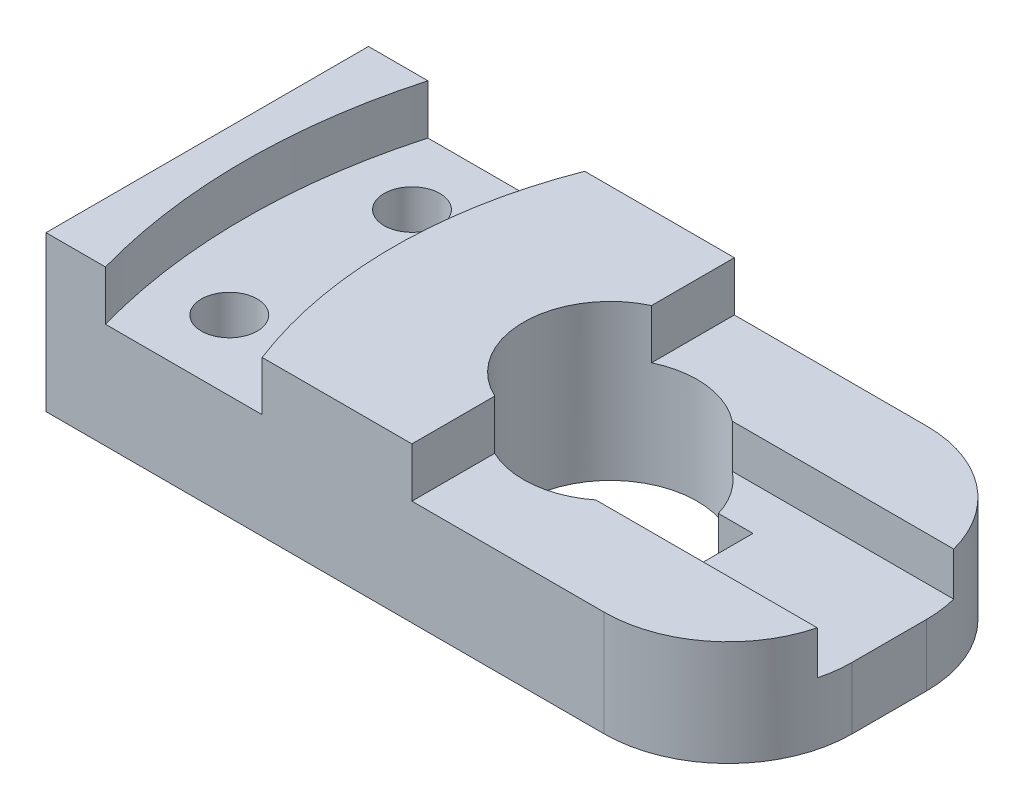
ISO-10303-21;
HEADER;
FILE_DESCRIPTION(('STEP AP214'),'2;1');
FILE_NAME('part.step','',(''),(''),'','','');
FILE_SCHEMA(('AUTOMOTIVE_DESIGN { 1 0 10303 214 1 1 1 1 }'));
ENDSEC;
DATA;
#1=APPLICATION_CONTEXT('core data for automotive mechanical design processes');
#2=APPLICATION_PROTOCOL_DEFINITION('international standard','automotive_design',2000,#1);
#3=PRODUCT_CONTEXT('',#1,'mechanical');
#4=PRODUCT('Part','Part','',(#3));
#5=PRODUCT_RELATED_PRODUCT_CATEGORY('part','',(#4));
#6=PRODUCT_DEFINITION_FORMATION('','',#4);
#7=PRODUCT_DEFINITION_CONTEXT('part definition',#1,'design');
#8=PRODUCT_DEFINITION('design','',#6,#7);
#9=PRODUCT_DEFINITION_SHAPE('','',#8);
#10=(LENGTH_UNIT() NAMED_UNIT(*) SI_UNIT(.MILLI.,.METRE.));
#11=(NAMED_UNIT(*) PLANE_ANGLE_UNIT() SI_UNIT($,.RADIAN.));
#12=(NAMED_UNIT(*) SI_UNIT($,.STERADIAN.) SOLID_ANGLE_UNIT());
#13=UNCERTAINTY_MEASURE_WITH_UNIT(LENGTH_MEASURE(1.E-05),#10,'distance_accuracy_value','');
#14=(GEOMETRIC_REPRESENTATION_CONTEXT(3) GLOBAL_UNCERTAINTY_ASSIGNED_CONTEXT((#13)) GLOBAL_UNIT_ASSIGNED_CONTEXT((#10,
#11,#12)) REPRESENTATION_CONTEXT('',''));
#15=CARTESIAN_POINT('',(0.,0.,0.));
#16=DIRECTION('',(0.,0.,1.));
#17=DIRECTION('',(1.,0.,0.));
#18=AXIS2_PLACEMENT_3D('',#15,#16,#17);
#19=CARTESIAN_POINT('',(0.,17.,0.));
#20=DIRECTION('',(0.,1.,0.));
#21=DIRECTION('',(0.,0.,1.));
#22=AXIS2_PLACEMENT_3D('',#19,#20,#21);
#23=PLANE('',#22);
#24=CARTESIAN_POINT('',(18.2858491223178,17.,-14.728915195243));
#25=DIRECTION('',(0.,1.,0.));
#26=DIRECTION('',(0.,0.,1.));
#27=AXIS2_PLACEMENT_3D('',#24,#25,#26);
#28=CIRCLE('',#27,4.5);
#29=CARTESIAN_POINT('',(18.2858491223178,17.,-10.228915195243));
#30=VERTEX_POINT('',#29);
#31=EDGE_CURVE('E285',#30,#30,#28,.T.);
#32=ORIENTED_EDGE('',*,*,#31,.F.);
#33=EDGE_LOOP('',(#32));
#34=FACE_BOUND('',#33,.T.);
#35=CARTESIAN_POINT('',(18.2858491223178,17.,14.728915195243));
#36=DIRECTION('',(0.,1.,0.));
#37=DIRECTION('',(0.,0.,1.));
#38=AXIS2_PLACEMENT_3D('',#35,#36,#37);
#39=CIRCLE('',#38,4.5);
#40=CARTESIAN_POINT('',(18.2858491223178,17.,19.228915195243));
#41=VERTEX_POINT('',#40);
#42=EDGE_CURVE('E315',#41,#41,#39,.F.);
#43=ORIENTED_EDGE('',*,*,#42,.T.);
#44=EDGE_LOOP('',(#43));
#45=FACE_BOUND('',#44,.T.);
#46=DIRECTION('',(1.,0.,0.));
#47=VECTOR('',#46,1.);
#48=CARTESIAN_POINT('',(0.,17.,26.));
#49=LINE('',#48,#47);
#50=CARTESIAN_POINT('',(9.58787958281661,17.,26.));
#51=VERTEX_POINT('',#50);
#52=CARTESIAN_POINT('',(34.8583586736219,17.,26.));
#53=VERTEX_POINT('',#52);
#54=EDGE_CURVE('E290',#51,#53,#49,.T.);
#55=ORIENTED_EDGE('',*,*,#54,.T.);
#56=CARTESIAN_POINT('',(102.,17.,0.));
#57=DIRECTION('',(0.,1.,0.));
#58=DIRECTION('',(0.,0.,1.));
#59=AXIS2_PLACEMENT_3D('',#56,#57,#58);
#60=CIRCLE('',#59,72.);
#61=CARTESIAN_POINT('',(34.8583586736219,17.,-26.));
#62=VERTEX_POINT('',#61);
#63=EDGE_CURVE('E11',#53,#62,#60,.F.);
#64=ORIENTED_EDGE('',*,*,#63,.T.);
#65=DIRECTION('',(1.,0.,0.));
#66=VECTOR('',#65,1.);
#67=CARTESIAN_POINT('',(0.,17.,-26.));
#68=LINE('',#67,#66);
#69=CARTESIAN_POINT('',(9.58787958281661,17.,-26.));
#70=VERTEX_POINT('',#69);
#71=EDGE_CURVE('E308',#70,#62,#68,.T.);
#72=ORIENTED_EDGE('',*,*,#71,.F.);
#73=CARTESIAN_POINT('',(102.,17.,0.));
#74=DIRECTION('',(0.,1.,0.));
#75=DIRECTION('',(0.,0.,1.));
#76=AXIS2_PLACEMENT_3D('',#73,#74,#75);
#77=CIRCLE('',#76,96.);
#78=EDGE_CURVE('E310',#70,#51,#77,.T.);
#79=ORIENTED_EDGE('',*,*,#78,.T.);
#80=EDGE_LOOP('',(#55,#64,#72,#79));
#81=FACE_BOUND('',#80,.T.);
#82=ADVANCED_FACE('F43',(#34,#45,#81),#23,.T.);
#83=CARTESIAN_POINT('',(59.,17.,-26.));
#84=VERTEX_POINT('',#83);
#85=CARTESIAN_POINT('',(90.,17.,-26.));
#86=VERTEX_POINT('',#85);
#87=EDGE_CURVE('E302',#84,#86,#68,.T.);
#88=ORIENTED_EDGE('',*,*,#87,.F.);
#89=DIRECTION('',(0.,0.,1.));
#90=VECTOR('',#89,1.);
#91=CARTESIAN_POINT('',(59.,17.,0.));
#92=LINE('',#91,#90);
#93=CARTESIAN_POINT('',(59.,17.,-12.6491106406735));
#94=VERTEX_POINT('',#93);
#95=EDGE_CURVE('E370',#84,#94,#92,.T.);
#96=ORIENTED_EDGE('',*,*,#95,.T.);
#97=CARTESIAN_POINT('',(65.,17.,0.));
#98=DIRECTION('',(0.,1.,0.));
#99=DIRECTION('',(0.,0.,1.));
#100=AXIS2_PLACEMENT_3D('',#97,#98,#99);
#101=CIRCLE('',#100,14.);
#102=CARTESIAN_POINT('',(73.6602540378444,17.,-11.));
#103=VERTEX_POINT('',#102);
#104=EDGE_CURVE('E296',#103,#94,#101,.T.);
#105=ORIENTED_EDGE('',*,*,#104,.F.);
#106=DIRECTION('',(1.,0.,0.));
#107=VECTOR('',#106,1.);
#108=CARTESIAN_POINT('',(0.,17.,-11.));
#109=LINE('',#108,#107);
#110=CARTESIAN_POINT('',(109.364916731037,17.,-11.));
#111=VERTEX_POINT('',#110);
#112=EDGE_CURVE('E297',#103,#111,#109,.T.);
#113=ORIENTED_EDGE('',*,*,#112,.T.);
#114=CARTESIAN_POINT('',(90.,17.,-6.));
#115=DIRECTION('',(0.,1.,0.));
#116=DIRECTION('',(0.,0.,1.));
#117=AXIS2_PLACEMENT_3D('',#114,#115,#116);
#118=CIRCLE('',#117,20.);
#119=EDGE_CURVE('E301',#111,#86,#118,.T.);
#120=ORIENTED_EDGE('',*,*,#119,.T.);
#121=EDGE_LOOP('',(#88,#96,#105,#113,#120));
#122=FACE_BOUND('',#121,.T.);
#123=ADVANCED_FACE('F406',(#122),#23,.T.);
#124=CARTESIAN_POINT('',(102.,25.,0.));
#125=DIRECTION('',(0.,-1.,0.));
#126=DIRECTION('',(0.,0.,-1.));
#127=AXIS2_PLACEMENT_3D('',#124,#125,#126);
#128=CYLINDRICAL_SURFACE('',#127,96.);
#129=ORIENTED_EDGE('',*,*,#78,.F.);
#130=DIRECTION('',(0.,-1.,0.));
#131=VECTOR('',#130,1.);
#132=CARTESIAN_POINT('',(9.58787958281661,25.,-26.));
#133=LINE('',#132,#131);
#134=CARTESIAN_POINT('',(9.58787958281661,25.,-26.));
#135=VERTEX_POINT('',#134);
#136=EDGE_CURVE('E365',#135,#70,#133,.T.);
#137=ORIENTED_EDGE('',*,*,#136,.F.);
#138=CARTESIAN_POINT('',(102.,25.,0.));
#139=DIRECTION('',(0.,1.,0.));
#140=DIRECTION('',(0.,0.,1.));
#141=AXIS2_PLACEMENT_3D('',#138,#139,#140);
#142=CIRCLE('',#141,96.);
#143=CARTESIAN_POINT('',(9.58787958281661,25.,26.));
#144=VERTEX_POINT('',#143);
#145=EDGE_CURVE('E344',#135,#144,#142,.T.);
#146=ORIENTED_EDGE('',*,*,#145,.T.);
#147=DIRECTION('',(0.,-1.,0.));
#148=VECTOR('',#147,1.);
#149=CARTESIAN_POINT('',(9.58787958281661,25.,26.));
#150=LINE('',#149,#148);
#151=EDGE_CURVE('E355',#144,#51,#150,.T.);
#152=ORIENTED_EDGE('',*,*,#151,.T.);
#153=EDGE_LOOP('',(#129,#137,#146,#152));
#154=FACE_BOUND('',#153,.T.);
#155=ADVANCED_FACE('F44',(#154),#128,.F.);
#156=CARTESIAN_POINT('',(0.,25.,-26.));
#157=DIRECTION('',(0.,0.,-1.));
#158=DIRECTION('',(-1.,0.,0.));
#159=AXIS2_PLACEMENT_3D('',#156,#157,#158);
#160=PLANE('',#159);
#161=DIRECTION('',(0.,-1.,0.));
#162=VECTOR('',#161,1.);
#163=CARTESIAN_POINT('',(90.,17.,-26.));
#164=LINE('',#163,#162);
#165=CARTESIAN_POINT('',(90.,0.,-26.));
#166=VERTEX_POINT('',#165);
#167=EDGE_CURVE('E312',#86,#166,#164,.T.);
#168=ORIENTED_EDGE('',*,*,#167,.T.);
#169=DIRECTION('',(1.,0.,0.));
#170=VECTOR('',#169,1.);
#171=CARTESIAN_POINT('',(0.,0.,-26.));
#172=LINE('',#171,#170);
#173=CARTESIAN_POINT('',(0.,0.,-26.));
#174=VERTEX_POINT('',#173);
#175=EDGE_CURVE('E337',#174,#166,#172,.T.);
#176=ORIENTED_EDGE('',*,*,#175,.F.);
#177=DIRECTION('',(0.,-1.,0.));
#178=VECTOR('',#177,1.);
#179=CARTESIAN_POINT('',(0.,25.,-26.));
#180=LINE('',#179,#178);
#181=CARTESIAN_POINT('',(0.,25.,-26.));
#182=VERTEX_POINT('',#181);
#183=EDGE_CURVE('E362',#182,#174,#180,.T.);
#184=ORIENTED_EDGE('',*,*,#183,.F.);
#185=DIRECTION('',(1.,0.,0.));
#186=VECTOR('',#185,1.);
#187=CARTESIAN_POINT('',(0.,25.,-26.));
#188=LINE('',#187,#186);
#189=EDGE_CURVE('E343',#182,#135,#188,.T.);
#190=ORIENTED_EDGE('',*,*,#189,.T.);
#191=ORIENTED_EDGE('',*,*,#136,.T.);
#192=ORIENTED_EDGE('',*,*,#71,.T.);
#193=DIRECTION('',(0.,-1.,0.));
#194=VECTOR('',#193,1.);
#195=CARTESIAN_POINT('',(34.8583586736219,25.,-26.));
#196=LINE('',#195,#194);
#197=CARTESIAN_POINT('',(34.8583586736219,25.,-26.));
#198=VERTEX_POINT('',#197);
#199=EDGE_CURVE('E278',#198,#62,#196,.T.);
#200=ORIENTED_EDGE('',*,*,#199,.F.);
#201=DIRECTION('',(1.,0.,0.));
#202=VECTOR('',#201,1.);
#203=CARTESIAN_POINT('',(0.,25.,-26.));
#204=LINE('',#203,#202);
#205=CARTESIAN_POINT('',(59.,25.,-26.));
#206=VERTEX_POINT('',#205);
#207=EDGE_CURVE('E201',#198,#206,#204,.T.);
#208=ORIENTED_EDGE('',*,*,#207,.T.);
#209=DIRECTION('',(0.,-1.,0.));
#210=VECTOR('',#209,1.);
#211=CARTESIAN_POINT('',(59.,25.,-26.));
#212=LINE('',#211,#210);
#213=EDGE_CURVE('E270',#206,#84,#212,.T.);
#214=ORIENTED_EDGE('',*,*,#213,.T.);
#215=ORIENTED_EDGE('',*,*,#87,.T.);
#216=EDGE_LOOP('',(#168,#176,#184,#190,#191,#192,#200,#208,#214,#215));
#217=FACE_BOUND('',#216,.T.);
#218=ADVANCED_FACE('F462',(#217),#160,.T.);
#219=CARTESIAN_POINT('',(0.,25.,0.));
#220=DIRECTION('',(-1.,0.,0.));
#221=DIRECTION('',(0.,0.,1.));
#222=AXIS2_PLACEMENT_3D('',#219,#220,#221);
#223=PLANE('',#222);
#224=DIRECTION('',(0.,0.,-1.));
#225=VECTOR('',#224,1.);
#226=CARTESIAN_POINT('',(0.,0.,0.));
#227=LINE('',#226,#225);
#228=CARTESIAN_POINT('',(0.,0.,26.));
#229=VERTEX_POINT('',#228);
#230=EDGE_CURVE('E352',#229,#174,#227,.T.);
#231=ORIENTED_EDGE('',*,*,#230,.F.);
#232=DIRECTION('',(0.,-1.,0.));
#233=VECTOR('',#232,1.);
#234=CARTESIAN_POINT('',(0.,25.,26.));
#235=LINE('',#234,#233);
#236=CARTESIAN_POINT('',(0.,25.,26.));
#237=VERTEX_POINT('',#236);
#238=EDGE_CURVE('E357',#237,#229,#235,.T.);
#239=ORIENTED_EDGE('',*,*,#238,.F.);
#240=DIRECTION('',(0.,0.,-1.));
#241=VECTOR('',#240,1.);
#242=CARTESIAN_POINT('',(0.,25.,0.));
#243=LINE('',#242,#241);
#244=EDGE_CURVE('E346',#237,#182,#243,.T.);
#245=ORIENTED_EDGE('',*,*,#244,.T.);
#246=ORIENTED_EDGE('',*,*,#183,.T.);
#247=EDGE_LOOP('',(#231,#239,#245,#246));
#248=FACE_BOUND('',#247,.T.);
#249=ADVANCED_FACE('F461',(#248),#223,.T.);
#250=CARTESIAN_POINT('',(0.,25.,26.));
#251=DIRECTION('',(0.,0.,-1.));
#252=DIRECTION('',(-1.,0.,0.));
#253=AXIS2_PLACEMENT_3D('',#250,#251,#252);
#254=PLANE('',#253);
#255=CARTESIAN_POINT('',(59.,17.,26.));
#256=VERTEX_POINT('',#255);
#257=CARTESIAN_POINT('',(90.,17.,26.));
#258=VERTEX_POINT('',#257);
#259=EDGE_CURVE('E289',#256,#258,#49,.T.);
#260=ORIENTED_EDGE('',*,*,#259,.F.);
#261=DIRECTION('',(0.,-1.,0.));
#262=VECTOR('',#261,1.);
#263=CARTESIAN_POINT('',(59.,25.,26.));
#264=LINE('',#263,#262);
#265=CARTESIAN_POINT('',(59.,25.,26.));
#266=VERTEX_POINT('',#265);
#267=EDGE_CURVE('E274',#266,#256,#264,.T.);
#268=ORIENTED_EDGE('',*,*,#267,.F.);
#269=DIRECTION('',(1.,0.,0.));
#270=VECTOR('',#269,1.);
#271=CARTESIAN_POINT('',(0.,25.,26.));
#272=LINE('',#271,#270);
#273=CARTESIAN_POINT('',(34.8583586736219,25.,26.));
#274=VERTEX_POINT('',#273);
#275=EDGE_CURVE('E260',#274,#266,#272,.T.);
#276=ORIENTED_EDGE('',*,*,#275,.F.);
#277=DIRECTION('',(0.,-1.,0.));
#278=VECTOR('',#277,1.);
#279=CARTESIAN_POINT('',(34.8583586736219,25.,26.));
#280=LINE('',#279,#278);
#281=EDGE_CURVE('E280',#274,#53,#280,.T.);
#282=ORIENTED_EDGE('',*,*,#281,.T.);
#283=ORIENTED_EDGE('',*,*,#54,.F.);
#284=ORIENTED_EDGE('',*,*,#151,.F.);
#285=DIRECTION('',(1.,0.,0.));
#286=VECTOR('',#285,1.);
#287=CARTESIAN_POINT('',(0.,25.,26.));
#288=LINE('',#287,#286);
#289=EDGE_CURVE('E354',#237,#144,#288,.T.);
#290=ORIENTED_EDGE('',*,*,#289,.F.);
#291=ORIENTED_EDGE('',*,*,#238,.T.);
#292=DIRECTION('',(1.,0.,0.));
#293=VECTOR('',#292,1.);
#294=CARTESIAN_POINT('',(0.,0.,26.));
#295=LINE('',#294,#293);
#296=CARTESIAN_POINT('',(90.,0.,26.));
#297=VERTEX_POINT('',#296);
#298=EDGE_CURVE('E342',#229,#297,#295,.T.);
#299=ORIENTED_EDGE('',*,*,#298,.T.);
#300=DIRECTION('',(0.,-1.,0.));
#301=VECTOR('',#300,1.);
#302=CARTESIAN_POINT('',(90.,17.,26.));
#303=LINE('',#302,#301);
#304=EDGE_CURVE('E336',#258,#297,#303,.T.);
#305=ORIENTED_EDGE('',*,*,#304,.F.);
#306=EDGE_LOOP('',(#260,#268,#276,#282,#283,#284,#290,#291,#299,#305));
#307=FACE_BOUND('',#306,.T.);
#308=ADVANCED_FACE('F457',(#307),#254,.F.);
#309=CARTESIAN_POINT('',(0.,25.,0.));
#310=DIRECTION('',(0.,1.,0.));
#311=DIRECTION('',(0.,0.,1.));
#312=AXIS2_PLACEMENT_3D('',#309,#310,#311);
#313=PLANE('',#312);
#314=ORIENTED_EDGE('',*,*,#145,.F.);
#315=ORIENTED_EDGE('',*,*,#189,.F.);
#316=ORIENTED_EDGE('',*,*,#244,.F.);
#317=ORIENTED_EDGE('',*,*,#289,.T.);
#318=EDGE_LOOP('',(#314,#315,#316,#317));
#319=FACE_BOUND('',#318,.T.);
#320=ADVANCED_FACE('F455',(#319),#313,.T.);
#321=CARTESIAN_POINT('',(0.,0.,0.));
#322=DIRECTION('',(0.,1.,0.));
#323=DIRECTION('',(0.,0.,1.));
#324=AXIS2_PLACEMENT_3D('',#321,#322,#323);
#325=PLANE('',#324);
#326=CARTESIAN_POINT('',(90.,0.,-6.));
#327=DIRECTION('',(0.,1.,0.));
#328=DIRECTION('',(0.,0.,1.));
#329=AXIS2_PLACEMENT_3D('',#326,#327,#328);
#330=CIRCLE('',#329,20.);
#331=CARTESIAN_POINT('',(110.,0.,-6.00000000000001));
#332=VERTEX_POINT('',#331);
#333=EDGE_CURVE('E321',#332,#166,#330,.T.);
#334=ORIENTED_EDGE('',*,*,#333,.F.);
#335=DIRECTION('',(0.,0.,-1.));
#336=VECTOR('',#335,1.);
#337=CARTESIAN_POINT('',(110.,0.,0.));
#338=LINE('',#337,#336);
#339=CARTESIAN_POINT('',(110.,0.,6.));
#340=VERTEX_POINT('',#339);
#341=EDGE_CURVE('E213',#340,#332,#338,.T.);
#342=ORIENTED_EDGE('',*,*,#341,.F.);
#343=CARTESIAN_POINT('',(90.,0.,6.));
#344=DIRECTION('',(0.,1.,0.));
#345=DIRECTION('',(0.,0.,1.));
#346=AXIS2_PLACEMENT_3D('',#343,#344,#345);
#347=CIRCLE('',#346,20.);
#348=EDGE_CURVE('E318',#297,#340,#347,.T.);
#349=ORIENTED_EDGE('',*,*,#348,.F.);
#350=ORIENTED_EDGE('',*,*,#298,.F.);
#351=ORIENTED_EDGE('',*,*,#230,.T.);
#352=ORIENTED_EDGE('',*,*,#175,.T.);
#353=EDGE_LOOP('',(#334,#342,#349,#350,#351,#352));
#354=FACE_BOUND('',#353,.T.);
#355=DIRECTION('',(-1.,0.,0.));
#356=VECTOR('',#355,1.);
#357=CARTESIAN_POINT('',(0.,0.,-3.99999999999999));
#358=LINE('',#357,#356);
#359=CARTESIAN_POINT('',(84.,0.,-3.99999999999999));
#360=VERTEX_POINT('',#359);
#361=CARTESIAN_POINT('',(78.4164078649987,0.,-3.99999999999999));
#362=VERTEX_POINT('',#361);
#363=EDGE_CURVE('E235',#360,#362,#358,.T.);
#364=ORIENTED_EDGE('',*,*,#363,.T.);
#365=CARTESIAN_POINT('',(65.,0.,0.));
#366=DIRECTION('',(0.,1.,0.));
#367=DIRECTION('',(0.,0.,1.));
#368=AXIS2_PLACEMENT_3D('',#365,#366,#367);
#369=CIRCLE('',#368,14.);
#370=CARTESIAN_POINT('',(78.4164078649987,0.,4.));
#371=VERTEX_POINT('',#370);
#372=EDGE_CURVE('E196',#362,#371,#369,.T.);
#373=ORIENTED_EDGE('',*,*,#372,.T.);
#374=DIRECTION('',(-1.,0.,0.));
#375=VECTOR('',#374,1.);
#376=CARTESIAN_POINT('',(0.,0.,4.00000000000002));
#377=LINE('',#376,#375);
#378=CARTESIAN_POINT('',(84.,0.,4.));
#379=VERTEX_POINT('',#378);
#380=EDGE_CURVE('E236',#379,#371,#377,.T.);
#381=ORIENTED_EDGE('',*,*,#380,.F.);
#382=DIRECTION('',(0.,0.,-1.));
#383=VECTOR('',#382,1.);
#384=CARTESIAN_POINT('',(84.,0.,0.));
#385=LINE('',#384,#383);
#386=EDGE_CURVE('E232',#379,#360,#385,.T.);
#387=ORIENTED_EDGE('',*,*,#386,.T.);
#388=EDGE_LOOP('',(#364,#373,#381,#387));
#389=FACE_BOUND('',#388,.T.);
#390=CARTESIAN_POINT('',(18.2858491223178,0.,-14.728915195243));
#391=DIRECTION('',(0.,1.,0.));
#392=DIRECTION('',(0.,0.,1.));
#393=AXIS2_PLACEMENT_3D('',#390,#391,#392);
#394=CIRCLE('',#393,4.5);
#395=CARTESIAN_POINT('',(18.2858491223178,0.,-10.228915195243));
#396=VERTEX_POINT('',#395);
#397=EDGE_CURVE('E281',#396,#396,#394,.T.);
#398=ORIENTED_EDGE('',*,*,#397,.T.);
#399=EDGE_LOOP('',(#398));
#400=FACE_BOUND('',#399,.T.);
#401=CARTESIAN_POINT('',(18.2858491223178,0.,14.728915195243));
#402=DIRECTION('',(0.,1.,0.));
#403=DIRECTION('',(0.,0.,1.));
#404=AXIS2_PLACEMENT_3D('',#401,#402,#403);
#405=CIRCLE('',#404,4.5);
#406=CARTESIAN_POINT('',(18.2858491223178,0.,19.228915195243));
#407=VERTEX_POINT('',#406);
#408=EDGE_CURVE('E286',#407,#407,#405,.F.);
#409=ORIENTED_EDGE('',*,*,#408,.F.);
#410=EDGE_LOOP('',(#409));
#411=FACE_BOUND('',#410,.T.);
#412=ADVANCED_FACE('F391',(#354,#389,#400,#411),#325,.F.);
#413=CARTESIAN_POINT('',(90.,17.,6.));
#414=DIRECTION('',(0.,-1.,0.));
#415=DIRECTION('',(0.,0.,-1.));
#416=AXIS2_PLACEMENT_3D('',#413,#414,#415);
#417=CYLINDRICAL_SURFACE('',#416,20.);
#418=ORIENTED_EDGE('',*,*,#348,.T.);
#419=DIRECTION('',(0.,-1.,0.));
#420=VECTOR('',#419,1.);
#421=CARTESIAN_POINT('',(110.,10.,6.));
#422=LINE('',#421,#420);
#423=CARTESIAN_POINT('',(110.,10.,6.));
#424=VERTEX_POINT('',#423);
#425=EDGE_CURVE('E242',#424,#340,#422,.T.);
#426=ORIENTED_EDGE('',*,*,#425,.F.);
#427=CARTESIAN_POINT('',(90.,10.,6.));
#428=DIRECTION('',(0.,1.,0.));
#429=DIRECTION('',(0.,0.,1.));
#430=AXIS2_PLACEMENT_3D('',#427,#428,#429);
#431=CIRCLE('',#430,20.);
#432=CARTESIAN_POINT('',(109.364916731037,10.,11.));
#433=VERTEX_POINT('',#432);
#434=EDGE_CURVE('E229',#433,#424,#431,.T.);
#435=ORIENTED_EDGE('',*,*,#434,.F.);
#436=DIRECTION('',(0.,-1.,0.));
#437=VECTOR('',#436,1.);
#438=CARTESIAN_POINT('',(109.364916731037,17.,11.));
#439=LINE('',#438,#437);
#440=CARTESIAN_POINT('',(109.364916731037,17.,11.));
#441=VERTEX_POINT('',#440);
#442=EDGE_CURVE('E333',#441,#433,#439,.T.);
#443=ORIENTED_EDGE('',*,*,#442,.F.);
#444=CARTESIAN_POINT('',(90.,17.,6.));
#445=DIRECTION('',(0.,1.,0.));
#446=DIRECTION('',(0.,0.,1.));
#447=AXIS2_PLACEMENT_3D('',#444,#445,#446);
#448=CIRCLE('',#447,20.);
#449=EDGE_CURVE('E292',#258,#441,#448,.T.);
#450=ORIENTED_EDGE('',*,*,#449,.F.);
#451=ORIENTED_EDGE('',*,*,#304,.T.);
#452=EDGE_LOOP('',(#418,#426,#435,#443,#450,#451));
#453=FACE_BOUND('',#452,.T.);
#454=ADVANCED_FACE('F448',(#453),#417,.T.);
#455=CARTESIAN_POINT('',(0.,17.,11.));
#456=DIRECTION('',(0.,0.,-1.));
#457=DIRECTION('',(-1.,0.,0.));
#458=AXIS2_PLACEMENT_3D('',#455,#456,#457);
#459=PLANE('',#458);
#460=DIRECTION('',(1.,0.,0.));
#461=VECTOR('',#460,1.);
#462=CARTESIAN_POINT('',(0.,10.,11.));
#463=LINE('',#462,#461);
#464=CARTESIAN_POINT('',(73.6602540378444,10.,11.));
#465=VERTEX_POINT('',#464);
#466=EDGE_CURVE('E59',#465,#433,#463,.T.);
#467=ORIENTED_EDGE('',*,*,#466,.F.);
#468=DIRECTION('',(0.,-1.,0.));
#469=VECTOR('',#468,1.);
#470=CARTESIAN_POINT('',(73.6602540378444,17.,11.));
#471=LINE('',#470,#469);
#472=CARTESIAN_POINT('',(73.6602540378444,17.,11.));
#473=VERTEX_POINT('',#472);
#474=EDGE_CURVE('E334',#473,#465,#471,.T.);
#475=ORIENTED_EDGE('',*,*,#474,.F.);
#476=DIRECTION('',(1.,0.,0.));
#477=VECTOR('',#476,1.);
#478=CARTESIAN_POINT('',(0.,17.,11.));
#479=LINE('',#478,#477);
#480=EDGE_CURVE('E291',#473,#441,#479,.T.);
#481=ORIENTED_EDGE('',*,*,#480,.T.);
#482=ORIENTED_EDGE('',*,*,#442,.T.);
#483=EDGE_LOOP('',(#467,#475,#481,#482));
#484=FACE_BOUND('',#483,.T.);
#485=ADVANCED_FACE('F385',(#484),#459,.T.);
#486=CARTESIAN_POINT('',(65.,17.,0.));
#487=DIRECTION('',(0.,-1.,0.));
#488=DIRECTION('',(0.,0.,-1.));
#489=AXIS2_PLACEMENT_3D('',#486,#487,#488);
#490=CYLINDRICAL_SURFACE('',#489,14.);
#491=ORIENTED_EDGE('',*,*,#474,.T.);
#492=CARTESIAN_POINT('',(65.,10.,0.));
#493=DIRECTION('',(0.,1.,0.));
#494=DIRECTION('',(0.,0.,1.));
#495=AXIS2_PLACEMENT_3D('',#492,#493,#494);
#496=CIRCLE('',#495,14.);
#497=CARTESIAN_POINT('',(78.4164078649987,10.,4.));
#498=VERTEX_POINT('',#497);
#499=EDGE_CURVE('E225',#465,#498,#496,.T.);
#500=ORIENTED_EDGE('',*,*,#499,.T.);
#501=DIRECTION('',(0.,-1.,0.));
#502=VECTOR('',#501,1.);
#503=CARTESIAN_POINT('',(78.4164078649987,10.,4.));
#504=LINE('',#503,#502);
#505=EDGE_CURVE('E250',#498,#371,#504,.T.);
#506=ORIENTED_EDGE('',*,*,#505,.T.);
#507=ORIENTED_EDGE('',*,*,#372,.F.);
#508=DIRECTION('',(0.,-1.,0.));
#509=VECTOR('',#508,1.);
#510=CARTESIAN_POINT('',(78.4164078649987,10.,-3.99999999999999));
#511=LINE('',#510,#509);
#512=CARTESIAN_POINT('',(78.4164078649987,10.,-3.99999999999999));
#513=VERTEX_POINT('',#512);
#514=EDGE_CURVE('E195',#513,#362,#511,.T.);
#515=ORIENTED_EDGE('',*,*,#514,.F.);
#516=CARTESIAN_POINT('',(65.,10.,0.));
#517=DIRECTION('',(0.,1.,0.));
#518=DIRECTION('',(0.,0.,1.));
#519=AXIS2_PLACEMENT_3D('',#516,#517,#518);
#520=CIRCLE('',#519,14.);
#521=CARTESIAN_POINT('',(73.6602540378444,10.,-11.));
#522=VERTEX_POINT('',#521);
#523=EDGE_CURVE('E198',#513,#522,#520,.T.);
#524=ORIENTED_EDGE('',*,*,#523,.T.);
#525=DIRECTION('',(0.,-1.,0.));
#526=VECTOR('',#525,1.);
#527=CARTESIAN_POINT('',(73.6602540378444,17.,-11.));
#528=LINE('',#527,#526);
#529=EDGE_CURVE('E332',#103,#522,#528,.T.);
#530=ORIENTED_EDGE('',*,*,#529,.F.);
#531=ORIENTED_EDGE('',*,*,#104,.T.);
#532=DIRECTION('',(0.,-1.,0.));
#533=VECTOR('',#532,1.);
#534=CARTESIAN_POINT('',(59.,25.,-12.6491106406735));
#535=LINE('',#534,#533);
#536=CARTESIAN_POINT('',(59.,25.,-12.6491106406735));
#537=VERTEX_POINT('',#536);
#538=EDGE_CURVE('E269',#537,#94,#535,.T.);
#539=ORIENTED_EDGE('',*,*,#538,.F.);
#540=CARTESIAN_POINT('',(65.,25.,0.));
#541=DIRECTION('',(0.,1.,0.));
#542=DIRECTION('',(0.,0.,1.));
#543=AXIS2_PLACEMENT_3D('',#540,#541,#542);
#544=CIRCLE('',#543,14.);
#545=CARTESIAN_POINT('',(59.,25.,12.6491106406735));
#546=VERTEX_POINT('',#545);
#547=EDGE_CURVE('E265',#537,#546,#544,.T.);
#548=ORIENTED_EDGE('',*,*,#547,.T.);
#549=DIRECTION('',(0.,-1.,0.));
#550=VECTOR('',#549,1.);
#551=CARTESIAN_POINT('',(59.,25.,12.6491106406735));
#552=LINE('',#551,#550);
#553=CARTESIAN_POINT('',(59.,17.,12.6491106406735));
#554=VERTEX_POINT('',#553);
#555=EDGE_CURVE('E275',#546,#554,#552,.T.);
#556=ORIENTED_EDGE('',*,*,#555,.T.);
#557=EDGE_CURVE('E299',#554,#473,#101,.T.);
#558=ORIENTED_EDGE('',*,*,#557,.T.);
#559=EDGE_LOOP('',(#491,#500,#506,#507,#515,#524,#530,#531,#539,#548,#556,#558));
#560=FACE_BOUND('',#559,.T.);
#561=ADVANCED_FACE('F192',(#560),#490,.F.);
#562=CARTESIAN_POINT('',(0.,17.,-11.));
#563=DIRECTION('',(0.,0.,-1.));
#564=DIRECTION('',(-1.,0.,0.));
#565=AXIS2_PLACEMENT_3D('',#562,#563,#564);
#566=PLANE('',#565);
#567=ORIENTED_EDGE('',*,*,#529,.T.);
#568=DIRECTION('',(1.,0.,0.));
#569=VECTOR('',#568,1.);
#570=CARTESIAN_POINT('',(0.,10.,-11.));
#571=LINE('',#570,#569);
#572=CARTESIAN_POINT('',(109.364916731037,10.,-11.));
#573=VERTEX_POINT('',#572);
#574=EDGE_CURVE('E211',#522,#573,#571,.T.);
#575=ORIENTED_EDGE('',*,*,#574,.T.);
#576=DIRECTION('',(0.,-1.,0.));
#577=VECTOR('',#576,1.);
#578=CARTESIAN_POINT('',(109.364916731037,17.,-11.));
#579=LINE('',#578,#577);
#580=EDGE_CURVE('E327',#111,#573,#579,.T.);
#581=ORIENTED_EDGE('',*,*,#580,.F.);
#582=ORIENTED_EDGE('',*,*,#112,.F.);
#583=EDGE_LOOP('',(#567,#575,#581,#582));
#584=FACE_BOUND('',#583,.T.);
#585=ADVANCED_FACE('F439',(#584),#566,.F.);
#586=CARTESIAN_POINT('',(90.,17.,-6.));
#587=DIRECTION('',(0.,-1.,0.));
#588=DIRECTION('',(0.,0.,-1.));
#589=AXIS2_PLACEMENT_3D('',#586,#587,#588);
#590=CYLINDRICAL_SURFACE('',#589,20.);
#591=ORIENTED_EDGE('',*,*,#333,.T.);
#592=ORIENTED_EDGE('',*,*,#167,.F.);
#593=ORIENTED_EDGE('',*,*,#119,.F.);
#594=ORIENTED_EDGE('',*,*,#580,.T.);
#595=CARTESIAN_POINT('',(90.,10.,-6.));
#596=DIRECTION('',(0.,1.,0.));
#597=DIRECTION('',(0.,0.,1.));
#598=AXIS2_PLACEMENT_3D('',#595,#596,#597);
#599=CIRCLE('',#598,20.);
#600=CARTESIAN_POINT('',(110.,10.,-6.00000000000001));
#601=VERTEX_POINT('',#600);
#602=EDGE_CURVE('E69',#601,#573,#599,.T.);
#603=ORIENTED_EDGE('',*,*,#602,.F.);
#604=DIRECTION('',(0.,-1.,0.));
#605=VECTOR('',#604,1.);
#606=CARTESIAN_POINT('',(110.,10.,-6.00000000000001));
#607=LINE('',#606,#605);
#608=EDGE_CURVE('E231',#601,#332,#607,.T.);
#609=ORIENTED_EDGE('',*,*,#608,.T.);
#610=EDGE_LOOP('',(#591,#592,#593,#594,#603,#609));
#611=FACE_BOUND('',#610,.T.);
#612=ADVANCED_FACE('F435',(#611),#590,.T.);
#613=CARTESIAN_POINT('',(18.2858491223178,17.,-14.728915195243));
#614=DIRECTION('',(0.,-1.,0.));
#615=DIRECTION('',(0.,0.,-1.));
#616=AXIS2_PLACEMENT_3D('',#613,#614,#615);
#617=CYLINDRICAL_SURFACE('',#616,4.5);
#618=ORIENTED_EDGE('',*,*,#31,.T.);
#619=EDGE_LOOP('',(#618));
#620=FACE_BOUND('',#619,.T.);
#621=ORIENTED_EDGE('',*,*,#397,.F.);
#622=EDGE_LOOP('',(#621));
#623=FACE_BOUND('',#622,.T.);
#624=ADVANCED_FACE('F430',(#620,#623),#617,.F.);
#625=CARTESIAN_POINT('',(18.2858491223178,17.,14.728915195243));
#626=DIRECTION('',(0.,-1.,0.));
#627=DIRECTION('',(0.,0.,-1.));
#628=AXIS2_PLACEMENT_3D('',#625,#626,#627);
#629=CYLINDRICAL_SURFACE('',#628,4.5);
#630=ORIENTED_EDGE('',*,*,#42,.F.);
#631=EDGE_LOOP('',(#630));
#632=FACE_BOUND('',#631,.T.);
#633=ORIENTED_EDGE('',*,*,#408,.T.);
#634=EDGE_LOOP('',(#633));
#635=FACE_BOUND('',#634,.T.);
#636=ADVANCED_FACE('F423',(#632,#635),#629,.F.);
#637=DIRECTION('',(0.,0.,-1.));
#638=VECTOR('',#637,1.);
#639=CARTESIAN_POINT('',(59.,17.,0.));
#640=LINE('',#639,#638);
#641=EDGE_CURVE('E51',#256,#554,#640,.T.);
#642=ORIENTED_EDGE('',*,*,#641,.F.);
#643=ORIENTED_EDGE('',*,*,#259,.T.);
#644=ORIENTED_EDGE('',*,*,#449,.T.);
#645=ORIENTED_EDGE('',*,*,#480,.F.);
#646=ORIENTED_EDGE('',*,*,#557,.F.);
#647=EDGE_LOOP('',(#642,#643,#644,#645,#646));
#648=FACE_BOUND('',#647,.T.);
#649=ADVANCED_FACE('F377',(#648),#23,.T.);
#650=CARTESIAN_POINT('',(102.,25.,0.));
#651=DIRECTION('',(0.,-1.,0.));
#652=DIRECTION('',(0.,0.,-1.));
#653=AXIS2_PLACEMENT_3D('',#650,#651,#652);
#654=CYLINDRICAL_SURFACE('',#653,72.);
#655=ORIENTED_EDGE('',*,*,#63,.F.);
#656=ORIENTED_EDGE('',*,*,#281,.F.);
#657=CARTESIAN_POINT('',(102.,25.,0.));
#658=DIRECTION('',(0.,1.,0.));
#659=DIRECTION('',(0.,0.,1.));
#660=AXIS2_PLACEMENT_3D('',#657,#658,#659);
#661=CIRCLE('',#660,72.);
#662=EDGE_CURVE('E254',#198,#274,#661,.T.);
#663=ORIENTED_EDGE('',*,*,#662,.F.);
#664=ORIENTED_EDGE('',*,*,#199,.T.);
#665=EDGE_LOOP('',(#655,#656,#663,#664));
#666=FACE_BOUND('',#665,.T.);
#667=ADVANCED_FACE('F419',(#666),#654,.T.);
#668=CARTESIAN_POINT('',(59.,25.,0.));
#669=DIRECTION('',(1.,0.,0.));
#670=DIRECTION('',(0.,0.,-1.));
#671=AXIS2_PLACEMENT_3D('',#668,#669,#670);
#672=PLANE('',#671);
#673=ORIENTED_EDGE('',*,*,#267,.T.);
#674=ORIENTED_EDGE('',*,*,#641,.T.);
#675=ORIENTED_EDGE('',*,*,#555,.F.);
#676=DIRECTION('',(0.,0.,1.));
#677=VECTOR('',#676,1.);
#678=CARTESIAN_POINT('',(59.,25.,0.));
#679=LINE('',#678,#677);
#680=EDGE_CURVE('E259',#546,#266,#679,.T.);
#681=ORIENTED_EDGE('',*,*,#680,.T.);
#682=EDGE_LOOP('',(#673,#674,#675,#681));
#683=FACE_BOUND('',#682,.T.);
#684=ADVANCED_FACE('F371',(#683),#672,.T.);
#685=CARTESIAN_POINT('',(59.,25.,0.));
#686=DIRECTION('',(-1.,0.,0.));
#687=DIRECTION('',(0.,0.,1.));
#688=AXIS2_PLACEMENT_3D('',#685,#686,#687);
#689=PLANE('',#688);
#690=ORIENTED_EDGE('',*,*,#95,.F.);
#691=ORIENTED_EDGE('',*,*,#213,.F.);
#692=DIRECTION('',(0.,0.,-1.));
#693=VECTOR('',#692,1.);
#694=CARTESIAN_POINT('',(59.,25.,0.));
#695=LINE('',#694,#693);
#696=EDGE_CURVE('E264',#537,#206,#695,.T.);
#697=ORIENTED_EDGE('',*,*,#696,.F.);
#698=ORIENTED_EDGE('',*,*,#538,.T.);
#699=EDGE_LOOP('',(#690,#691,#697,#698));
#700=FACE_BOUND('',#699,.T.);
#701=ADVANCED_FACE('F502',(#700),#689,.F.);
#702=CARTESIAN_POINT('',(0.,25.,0.));
#703=DIRECTION('',(0.,1.,0.));
#704=DIRECTION('',(0.,0.,1.));
#705=AXIS2_PLACEMENT_3D('',#702,#703,#704);
#706=PLANE('',#705);
#707=ORIENTED_EDGE('',*,*,#207,.F.);
#708=ORIENTED_EDGE('',*,*,#662,.T.);
#709=ORIENTED_EDGE('',*,*,#275,.T.);
#710=ORIENTED_EDGE('',*,*,#680,.F.);
#711=ORIENTED_EDGE('',*,*,#547,.F.);
#712=ORIENTED_EDGE('',*,*,#696,.T.);
#713=EDGE_LOOP('',(#707,#708,#709,#710,#711,#712));
#714=FACE_BOUND('',#713,.T.);
#715=ADVANCED_FACE('F404',(#714),#706,.T.);
#716=CARTESIAN_POINT('',(0.,10.,-3.99999999999999));
#717=DIRECTION('',(0.,0.,1.));
#718=DIRECTION('',(1.,0.,0.));
#719=AXIS2_PLACEMENT_3D('',#716,#717,#718);
#720=PLANE('',#719);
#721=ORIENTED_EDGE('',*,*,#363,.F.);
#722=DIRECTION('',(0.,-1.,0.));
#723=VECTOR('',#722,1.);
#724=CARTESIAN_POINT('',(84.,10.,-3.99999999999999));
#725=LINE('',#724,#723);
#726=CARTESIAN_POINT('',(84.,10.,-3.99999999999999));
#727=VERTEX_POINT('',#726);
#728=EDGE_CURVE('E204',#727,#360,#725,.T.);
#729=ORIENTED_EDGE('',*,*,#728,.F.);
#730=DIRECTION('',(-1.,0.,0.));
#731=VECTOR('',#730,1.);
#732=CARTESIAN_POINT('',(0.,10.,-3.99999999999999));
#733=LINE('',#732,#731);
#734=EDGE_CURVE('E207',#727,#513,#733,.T.);
#735=ORIENTED_EDGE('',*,*,#734,.T.);
#736=ORIENTED_EDGE('',*,*,#514,.T.);
#737=EDGE_LOOP('',(#721,#729,#735,#736));
#738=FACE_BOUND('',#737,.T.);
#739=ADVANCED_FACE('F214',(#738),#720,.T.);
#740=CARTESIAN_POINT('',(84.,10.,0.));
#741=DIRECTION('',(-1.,0.,0.));
#742=DIRECTION('',(0.,0.,1.));
#743=AXIS2_PLACEMENT_3D('',#740,#741,#742);
#744=PLANE('',#743);
#745=ORIENTED_EDGE('',*,*,#386,.F.);
#746=DIRECTION('',(0.,-1.,0.));
#747=VECTOR('',#746,1.);
#748=CARTESIAN_POINT('',(84.,10.,4.));
#749=LINE('',#748,#747);
#750=CARTESIAN_POINT('',(84.,10.,4.));
#751=VERTEX_POINT('',#750);
#752=EDGE_CURVE('E247',#751,#379,#749,.T.);
#753=ORIENTED_EDGE('',*,*,#752,.F.);
#754=DIRECTION('',(0.,0.,-1.));
#755=VECTOR('',#754,1.);
#756=CARTESIAN_POINT('',(84.,10.,0.));
#757=LINE('',#756,#755);
#758=EDGE_CURVE('E216',#751,#727,#757,.T.);
#759=ORIENTED_EDGE('',*,*,#758,.T.);
#760=ORIENTED_EDGE('',*,*,#728,.T.);
#761=EDGE_LOOP('',(#745,#753,#759,#760));
#762=FACE_BOUND('',#761,.T.);
#763=ADVANCED_FACE('F392',(#762),#744,.T.);
#764=CARTESIAN_POINT('',(0.,10.,4.00000000000002));
#765=DIRECTION('',(0.,0.,1.));
#766=DIRECTION('',(1.,0.,0.));
#767=AXIS2_PLACEMENT_3D('',#764,#765,#766);
#768=PLANE('',#767);
#769=ORIENTED_EDGE('',*,*,#380,.T.);
#770=ORIENTED_EDGE('',*,*,#505,.F.);
#771=DIRECTION('',(-1.,0.,0.));
#772=VECTOR('',#771,1.);
#773=CARTESIAN_POINT('',(0.,10.,4.00000000000002));
#774=LINE('',#773,#772);
#775=EDGE_CURVE('E217',#751,#498,#774,.T.);
#776=ORIENTED_EDGE('',*,*,#775,.F.);
#777=ORIENTED_EDGE('',*,*,#752,.T.);
#778=EDGE_LOOP('',(#769,#770,#776,#777));
#779=FACE_BOUND('',#778,.T.);
#780=ADVANCED_FACE('F389',(#779),#768,.F.);
#781=CARTESIAN_POINT('',(110.,10.,0.));
#782=DIRECTION('',(-1.,0.,0.));
#783=DIRECTION('',(0.,0.,1.));
#784=AXIS2_PLACEMENT_3D('',#781,#782,#783);
#785=PLANE('',#784);
#786=ORIENTED_EDGE('',*,*,#341,.T.);
#787=ORIENTED_EDGE('',*,*,#608,.F.);
#788=DIRECTION('',(0.,0.,-1.));
#789=VECTOR('',#788,1.);
#790=CARTESIAN_POINT('',(110.,10.,0.));
#791=LINE('',#790,#789);
#792=EDGE_CURVE('E230',#424,#601,#791,.T.);
#793=ORIENTED_EDGE('',*,*,#792,.F.);
#794=ORIENTED_EDGE('',*,*,#425,.T.);
#795=EDGE_LOOP('',(#786,#787,#793,#794));
#796=FACE_BOUND('',#795,.T.);
#797=ADVANCED_FACE('F405',(#796),#785,.F.);
#798=CARTESIAN_POINT('',(0.,10.,0.));
#799=DIRECTION('',(0.,1.,0.));
#800=DIRECTION('',(0.,0.,1.));
#801=AXIS2_PLACEMENT_3D('',#798,#799,#800);
#802=PLANE('',#801);
#803=ORIENTED_EDGE('',*,*,#523,.F.);
#804=ORIENTED_EDGE('',*,*,#734,.F.);
#805=ORIENTED_EDGE('',*,*,#758,.F.);
#806=ORIENTED_EDGE('',*,*,#775,.T.);
#807=ORIENTED_EDGE('',*,*,#499,.F.);
#808=ORIENTED_EDGE('',*,*,#466,.T.);
#809=ORIENTED_EDGE('',*,*,#434,.T.);
#810=ORIENTED_EDGE('',*,*,#792,.T.);
#811=ORIENTED_EDGE('',*,*,#602,.T.);
#812=ORIENTED_EDGE('',*,*,#574,.F.);
#813=EDGE_LOOP('',(#803,#804,#805,#806,#807,#808,#809,#810,#811,#812));
#814=FACE_BOUND('',#813,.T.);
#815=ADVANCED_FACE('F210',(#814),#802,.T.);
#816=CLOSED_SHELL('',(#82,#123,#155,#218,#249,#308,#320,#412,#454,#485,#561,#585,#612,#624,#636,
#649,#667,#684,#701,#715,#739,#763,#780,#797,#815));
#817=MANIFOLD_SOLID_BREP('B2',#816);
#818=ADVANCED_BREP_SHAPE_REPRESENTATION('',(#18,#817),#14);
#819=SHAPE_DEFINITION_REPRESENTATION(#9,#818);
ENDSEC;
END-ISO-10303-21;
